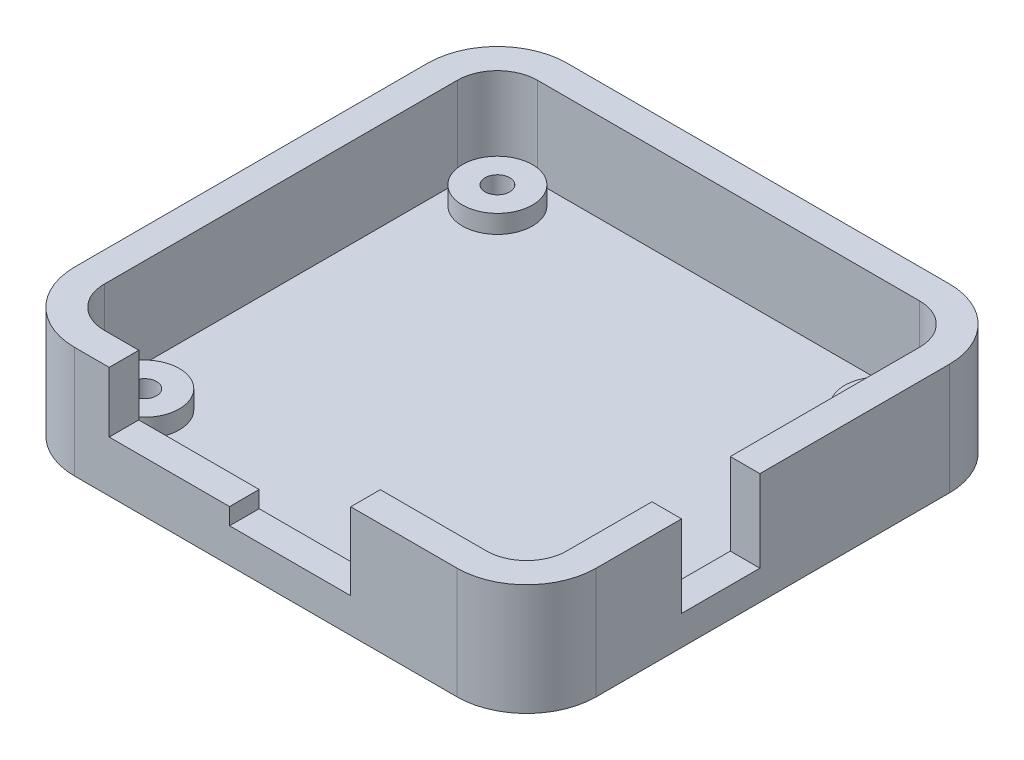
ISO-10303-21;
HEADER;
FILE_DESCRIPTION(('STEP AP214'),'2;1');
FILE_NAME('part.step','',(''),(''),'','','');
FILE_SCHEMA(('AUTOMOTIVE_DESIGN { 1 0 10303 214 1 1 1 1 }'));
ENDSEC;
DATA;
#1=APPLICATION_CONTEXT('core data for automotive mechanical design processes');
#2=APPLICATION_PROTOCOL_DEFINITION('international standard','automotive_design',2000,#1);
#3=PRODUCT_CONTEXT('',#1,'mechanical');
#4=PRODUCT('Part','Part','',(#3));
#5=PRODUCT_RELATED_PRODUCT_CATEGORY('part','',(#4));
#6=PRODUCT_DEFINITION_FORMATION('','',#4);
#7=PRODUCT_DEFINITION_CONTEXT('part definition',#1,'design');
#8=PRODUCT_DEFINITION('design','',#6,#7);
#9=PRODUCT_DEFINITION_SHAPE('','',#8);
#10=(LENGTH_UNIT() NAMED_UNIT(*) SI_UNIT(.MILLI.,.METRE.));
#11=(NAMED_UNIT(*) PLANE_ANGLE_UNIT() SI_UNIT($,.RADIAN.));
#12=(NAMED_UNIT(*) SI_UNIT($,.STERADIAN.) SOLID_ANGLE_UNIT());
#13=UNCERTAINTY_MEASURE_WITH_UNIT(LENGTH_MEASURE(1.E-05),#10,'distance_accuracy_value','');
#14=(GEOMETRIC_REPRESENTATION_CONTEXT(3) GLOBAL_UNCERTAINTY_ASSIGNED_CONTEXT((#13)) GLOBAL_UNIT_ASSIGNED_CONTEXT((#10,
#11,#12)) REPRESENTATION_CONTEXT('',''));
#15=CARTESIAN_POINT('',(0.,0.,0.));
#16=DIRECTION('',(0.,0.,1.));
#17=DIRECTION('',(1.,0.,0.));
#18=AXIS2_PLACEMENT_3D('',#15,#16,#17);
#19=CARTESIAN_POINT('',(42.304,11.3,3.556));
#20=DIRECTION('',(0.,1.,0.));
#21=DIRECTION('',(0.,0.,1.));
#22=AXIS2_PLACEMENT_3D('',#19,#20,#21);
#23=PLANE('',#22);
#24=DIRECTION('',(0.,0.,1.));
#25=VECTOR('',#24,1.);
#26=CARTESIAN_POINT('',(7.056,11.3,-3.501));
#27=LINE('',#26,#25);
#28=CARTESIAN_POINT('',(7.056,11.3,43.4));
#29=VERTEX_POINT('',#28);
#30=CARTESIAN_POINT('',(7.056,11.3,46.4));
#31=VERTEX_POINT('',#30);
#32=EDGE_CURVE('E605',#29,#31,#27,.T.);
#33=ORIENTED_EDGE('',*,*,#32,.F.);
#34=DIRECTION('',(-1.,0.,0.));
#35=VECTOR('',#34,1.);
#36=CARTESIAN_POINT('',(0.,11.3,43.4));
#37=LINE('',#36,#35);
#38=CARTESIAN_POINT('',(3.556,11.3,43.4));
#39=VERTEX_POINT('',#38);
#40=EDGE_CURVE('E318',#29,#39,#37,.T.);
#41=ORIENTED_EDGE('',*,*,#40,.T.);
#42=CARTESIAN_POINT('',(3.556,11.3,39.344));
#43=DIRECTION('',(0.,1.,0.));
#44=DIRECTION('',(0.,0.,1.));
#45=AXIS2_PLACEMENT_3D('',#42,#43,#44);
#46=CIRCLE('',#45,4.056);
#47=CARTESIAN_POINT('',(-0.499999999999998,11.3,39.344));
#48=VERTEX_POINT('',#47);
#49=EDGE_CURVE('E317',#48,#39,#46,.T.);
#50=ORIENTED_EDGE('',*,*,#49,.F.);
#51=DIRECTION('',(0.,0.,-1.));
#52=VECTOR('',#51,1.);
#53=CARTESIAN_POINT('',(-0.5,11.3,0.));
#54=LINE('',#53,#52);
#55=CARTESIAN_POINT('',(-0.5,11.3,3.556));
#56=VERTEX_POINT('',#55);
#57=EDGE_CURVE('E356',#48,#56,#54,.T.);
#58=ORIENTED_EDGE('',*,*,#57,.T.);
#59=CARTESIAN_POINT('',(3.556,11.3,3.556));
#60=DIRECTION('',(0.,1.,0.));
#61=DIRECTION('',(0.,0.,1.));
#62=AXIS2_PLACEMENT_3D('',#59,#60,#61);
#63=CIRCLE('',#62,4.056);
#64=CARTESIAN_POINT('',(3.556,11.3,-0.5));
#65=VERTEX_POINT('',#64);
#66=EDGE_CURVE('E649',#65,#56,#63,.T.);
#67=ORIENTED_EDGE('',*,*,#66,.F.);
#68=DIRECTION('',(-1.,0.,0.));
#69=VECTOR('',#68,1.);
#70=CARTESIAN_POINT('',(0.,11.3,-0.5));
#71=LINE('',#70,#69);
#72=CARTESIAN_POINT('',(42.304,11.3,-0.500000000000002));
#73=VERTEX_POINT('',#72);
#74=EDGE_CURVE('E652',#73,#65,#71,.T.);
#75=ORIENTED_EDGE('',*,*,#74,.F.);
#76=CARTESIAN_POINT('',(42.304,11.3,3.556));
#77=DIRECTION('',(0.,1.,0.));
#78=DIRECTION('',(0.,0.,1.));
#79=AXIS2_PLACEMENT_3D('',#76,#77,#78);
#80=CIRCLE('',#79,4.056);
#81=CARTESIAN_POINT('',(46.36,11.3,3.556));
#82=VERTEX_POINT('',#81);
#83=EDGE_CURVE('E656',#82,#73,#80,.T.);
#84=ORIENTED_EDGE('',*,*,#83,.F.);
#85=DIRECTION('',(0.,0.,-1.));
#86=VECTOR('',#85,1.);
#87=CARTESIAN_POINT('',(46.36,11.3,0.));
#88=LINE('',#87,#86);
#89=CARTESIAN_POINT('',(46.36,11.3,22.756));
#90=VERTEX_POINT('',#89);
#91=EDGE_CURVE('E658',#90,#82,#88,.T.);
#92=ORIENTED_EDGE('',*,*,#91,.F.);
#93=DIRECTION('',(1.,0.,0.));
#94=VECTOR('',#93,1.);
#95=CARTESIAN_POINT('',(-3.501,11.3,22.756));
#96=LINE('',#95,#94);
#97=CARTESIAN_POINT('',(49.36,11.3,22.756));
#98=VERTEX_POINT('',#97);
#99=EDGE_CURVE('E636',#90,#98,#96,.T.);
#100=ORIENTED_EDGE('',*,*,#99,.T.);
#101=DIRECTION('',(0.,0.,-1.));
#102=VECTOR('',#101,1.);
#103=CARTESIAN_POINT('',(49.36,11.3,0.));
#104=LINE('',#103,#102);
#105=CARTESIAN_POINT('',(49.36,11.3,3.556));
#106=VERTEX_POINT('',#105);
#107=EDGE_CURVE('E415',#98,#106,#104,.T.);
#108=ORIENTED_EDGE('',*,*,#107,.T.);
#109=CARTESIAN_POINT('',(42.304,11.3,3.556));
#110=DIRECTION('',(0.,1.,0.));
#111=DIRECTION('',(0.,0.,1.));
#112=AXIS2_PLACEMENT_3D('',#109,#110,#111);
#113=CIRCLE('',#112,7.056);
#114=CARTESIAN_POINT('',(42.304,11.3,-3.5));
#115=VERTEX_POINT('',#114);
#116=EDGE_CURVE('E361',#106,#115,#113,.T.);
#117=ORIENTED_EDGE('',*,*,#116,.T.);
#118=DIRECTION('',(-1.,0.,0.));
#119=VECTOR('',#118,1.);
#120=CARTESIAN_POINT('',(0.,11.3,-3.5));
#121=LINE('',#120,#119);
#122=CARTESIAN_POINT('',(3.556,11.3,-3.5));
#123=VERTEX_POINT('',#122);
#124=EDGE_CURVE('E391',#115,#123,#121,.T.);
#125=ORIENTED_EDGE('',*,*,#124,.T.);
#126=CARTESIAN_POINT('',(3.556,11.3,3.556));
#127=DIRECTION('',(0.,1.,0.));
#128=DIRECTION('',(0.,0.,1.));
#129=AXIS2_PLACEMENT_3D('',#126,#127,#128);
#130=CIRCLE('',#129,7.056);
#131=CARTESIAN_POINT('',(-3.5,11.3,3.556));
#132=VERTEX_POINT('',#131);
#133=EDGE_CURVE('E395',#123,#132,#130,.T.);
#134=ORIENTED_EDGE('',*,*,#133,.T.);
#135=DIRECTION('',(0.,0.,-1.));
#136=VECTOR('',#135,1.);
#137=CARTESIAN_POINT('',(-3.5,11.3,0.));
#138=LINE('',#137,#136);
#139=CARTESIAN_POINT('',(-3.5,11.3,39.344));
#140=VERTEX_POINT('',#139);
#141=EDGE_CURVE('E399',#140,#132,#138,.T.);
#142=ORIENTED_EDGE('',*,*,#141,.F.);
#143=CARTESIAN_POINT('',(3.556,11.3,39.344));
#144=DIRECTION('',(0.,1.,0.));
#145=DIRECTION('',(0.,0.,1.));
#146=AXIS2_PLACEMENT_3D('',#143,#144,#145);
#147=CIRCLE('',#146,7.056);
#148=CARTESIAN_POINT('',(3.556,11.3,46.4));
#149=VERTEX_POINT('',#148);
#150=EDGE_CURVE('E403',#140,#149,#147,.T.);
#151=ORIENTED_EDGE('',*,*,#150,.T.);
#152=DIRECTION('',(-1.,0.,0.));
#153=VECTOR('',#152,1.);
#154=CARTESIAN_POINT('',(0.,11.3,46.4));
#155=LINE('',#154,#153);
#156=EDGE_CURVE('E407',#31,#149,#155,.T.);
#157=ORIENTED_EDGE('',*,*,#156,.F.);
#158=EDGE_LOOP('',(#33,#41,#50,#58,#67,#75,#84,#92,#100,#108,#117,#125,#134,#142,#151,#157));
#159=FACE_BOUND('',#158,.T.);
#160=ADVANCED_FACE('F114',(#159),#23,.T.);
#161=CARTESIAN_POINT('',(0.,2.3,0.));
#162=DIRECTION('',(0.,1.,0.));
#163=DIRECTION('',(0.,0.,1.));
#164=AXIS2_PLACEMENT_3D('',#161,#162,#163);
#165=PLANE('',#164);
#166=CARTESIAN_POINT('',(3.556,2.3,3.556));
#167=DIRECTION('',(0.,1.,0.));
#168=DIRECTION('',(0.,0.,1.));
#169=AXIS2_PLACEMENT_3D('',#166,#167,#168);
#170=CIRCLE('',#169,4.056);
#171=CARTESIAN_POINT('',(3.556,2.3,-0.5));
#172=VERTEX_POINT('',#171);
#173=CARTESIAN_POINT('',(-0.5,2.3,3.556));
#174=VERTEX_POINT('',#173);
#175=EDGE_CURVE('E334',#172,#174,#170,.T.);
#176=ORIENTED_EDGE('',*,*,#175,.T.);
#177=DIRECTION('',(0.,0.,-1.));
#178=VECTOR('',#177,1.);
#179=CARTESIAN_POINT('',(-0.5,2.3,0.));
#180=LINE('',#179,#178);
#181=CARTESIAN_POINT('',(-0.499999999999998,2.3,39.344));
#182=VERTEX_POINT('',#181);
#183=EDGE_CURVE('E330',#182,#174,#180,.T.);
#184=ORIENTED_EDGE('',*,*,#183,.F.);
#185=CARTESIAN_POINT('',(3.556,2.3,39.344));
#186=DIRECTION('',(0.,1.,0.));
#187=DIRECTION('',(0.,0.,1.));
#188=AXIS2_PLACEMENT_3D('',#185,#186,#187);
#189=CIRCLE('',#188,4.056);
#190=CARTESIAN_POINT('',(3.556,2.3,43.4));
#191=VERTEX_POINT('',#190);
#192=EDGE_CURVE('E353',#182,#191,#189,.T.);
#193=ORIENTED_EDGE('',*,*,#192,.T.);
#194=DIRECTION('',(-1.,0.,0.));
#195=VECTOR('',#194,1.);
#196=CARTESIAN_POINT('',(0.,2.3,43.4));
#197=LINE('',#196,#195);
#198=CARTESIAN_POINT('',(42.304,2.3,43.4));
#199=VERTEX_POINT('',#198);
#200=EDGE_CURVE('E349',#199,#191,#197,.T.);
#201=ORIENTED_EDGE('',*,*,#200,.F.);
#202=CARTESIAN_POINT('',(42.304,2.3,39.344));
#203=DIRECTION('',(0.,1.,0.));
#204=DIRECTION('',(0.,0.,1.));
#205=AXIS2_PLACEMENT_3D('',#202,#203,#204);
#206=CIRCLE('',#205,4.056);
#207=CARTESIAN_POINT('',(46.36,2.3,39.344));
#208=VERTEX_POINT('',#207);
#209=EDGE_CURVE('E346',#199,#208,#206,.T.);
#210=ORIENTED_EDGE('',*,*,#209,.T.);
#211=DIRECTION('',(0.,0.,-1.));
#212=VECTOR('',#211,1.);
#213=CARTESIAN_POINT('',(46.36,2.3,0.));
#214=LINE('',#213,#212);
#215=CARTESIAN_POINT('',(46.36,2.3,3.556));
#216=VERTEX_POINT('',#215);
#217=EDGE_CURVE('E343',#208,#216,#214,.T.);
#218=ORIENTED_EDGE('',*,*,#217,.T.);
#219=CARTESIAN_POINT('',(42.304,2.3,3.556));
#220=DIRECTION('',(0.,1.,0.));
#221=DIRECTION('',(0.,0.,1.));
#222=AXIS2_PLACEMENT_3D('',#219,#220,#221);
#223=CIRCLE('',#222,4.056);
#224=CARTESIAN_POINT('',(42.304,2.3,-0.5));
#225=VERTEX_POINT('',#224);
#226=EDGE_CURVE('E340',#216,#225,#223,.T.);
#227=ORIENTED_EDGE('',*,*,#226,.T.);
#228=DIRECTION('',(-1.,0.,0.));
#229=VECTOR('',#228,1.);
#230=CARTESIAN_POINT('',(0.,2.3,-0.5));
#231=LINE('',#230,#229);
#232=EDGE_CURVE('E337',#225,#172,#231,.T.);
#233=ORIENTED_EDGE('',*,*,#232,.T.);
#234=EDGE_LOOP('',(#176,#184,#193,#201,#210,#218,#227,#233));
#235=FACE_BOUND('',#234,.T.);
#236=CARTESIAN_POINT('',(42.304,2.3,39.344));
#237=DIRECTION('',(0.,1.,0.));
#238=DIRECTION('',(0.,0.,1.));
#239=AXIS2_PLACEMENT_3D('',#236,#237,#238);
#240=CIRCLE('',#239,3.55);
#241=CARTESIAN_POINT('',(42.304,2.3,42.894));
#242=VERTEX_POINT('',#241);
#243=EDGE_CURVE('E436',#242,#242,#240,.T.);
#244=ORIENTED_EDGE('',*,*,#243,.F.);
#245=EDGE_LOOP('',(#244));
#246=FACE_BOUND('',#245,.T.);
#247=CARTESIAN_POINT('',(3.556,2.3,3.556));
#248=DIRECTION('',(0.,1.,0.));
#249=DIRECTION('',(0.,0.,1.));
#250=AXIS2_PLACEMENT_3D('',#247,#248,#249);
#251=CIRCLE('',#250,3.55);
#252=CARTESIAN_POINT('',(3.556,2.3,7.106));
#253=VERTEX_POINT('',#252);
#254=EDGE_CURVE('E459',#253,#253,#251,.T.);
#255=ORIENTED_EDGE('',*,*,#254,.F.);
#256=EDGE_LOOP('',(#255));
#257=FACE_BOUND('',#256,.T.);
#258=CARTESIAN_POINT('',(42.304,2.3,3.556));
#259=DIRECTION('',(0.,1.,0.));
#260=DIRECTION('',(0.,0.,1.));
#261=AXIS2_PLACEMENT_3D('',#258,#259,#260);
#262=CIRCLE('',#261,3.55);
#263=CARTESIAN_POINT('',(42.304,2.3,7.106));
#264=VERTEX_POINT('',#263);
#265=EDGE_CURVE('E448',#264,#264,#262,.T.);
#266=ORIENTED_EDGE('',*,*,#265,.F.);
#267=EDGE_LOOP('',(#266));
#268=FACE_BOUND('',#267,.T.);
#269=CARTESIAN_POINT('',(3.556,2.3,39.344));
#270=DIRECTION('',(0.,1.,0.));
#271=DIRECTION('',(0.,0.,1.));
#272=AXIS2_PLACEMENT_3D('',#269,#270,#271);
#273=CIRCLE('',#272,3.55);
#274=CARTESIAN_POINT('',(3.556,2.3,42.894));
#275=VERTEX_POINT('',#274);
#276=EDGE_CURVE('E424',#275,#275,#273,.T.);
#277=ORIENTED_EDGE('',*,*,#276,.F.);
#278=EDGE_LOOP('',(#277));
#279=FACE_BOUND('',#278,.T.);
#280=ADVANCED_FACE('F682',(#235,#246,#257,#268,#279),#165,.T.);
#281=CARTESIAN_POINT('',(3.556,2.3,3.556));
#282=DIRECTION('',(0.,-1.,0.));
#283=DIRECTION('',(0.,0.,-1.));
#284=AXIS2_PLACEMENT_3D('',#281,#282,#283);
#285=CYLINDRICAL_SURFACE('',#284,7.056);
#286=CARTESIAN_POINT('',(3.556,0.,3.556));
#287=DIRECTION('',(0.,1.,0.));
#288=DIRECTION('',(0.,0.,1.));
#289=AXIS2_PLACEMENT_3D('',#286,#287,#288);
#290=CIRCLE('',#289,7.056);
#291=CARTESIAN_POINT('',(-3.5,0.,3.556));
#292=VERTEX_POINT('',#291);
#293=CARTESIAN_POINT('',(3.556,0.,-3.5));
#294=VERTEX_POINT('',#293);
#295=EDGE_CURVE('E464',#292,#294,#290,.F.);
#296=ORIENTED_EDGE('',*,*,#295,.F.);
#297=DIRECTION('',(0.,-1.,0.));
#298=VECTOR('',#297,1.);
#299=CARTESIAN_POINT('',(-3.5,2.3,3.556));
#300=LINE('',#299,#298);
#301=EDGE_CURVE('E12',#132,#292,#300,.T.);
#302=ORIENTED_EDGE('',*,*,#301,.F.);
#303=ORIENTED_EDGE('',*,*,#133,.F.);
#304=DIRECTION('',(0.,-1.,0.));
#305=VECTOR('',#304,1.);
#306=CARTESIAN_POINT('',(3.556,2.3,-3.5));
#307=LINE('',#306,#305);
#308=EDGE_CURVE('E515',#123,#294,#307,.T.);
#309=ORIENTED_EDGE('',*,*,#308,.T.);
#310=EDGE_LOOP('',(#296,#302,#303,#309));
#311=FACE_BOUND('',#310,.T.);
#312=ADVANCED_FACE('F116',(#311),#285,.T.);
#313=CARTESIAN_POINT('',(-3.5,2.3,0.));
#314=DIRECTION('',(1.,0.,0.));
#315=DIRECTION('',(0.,0.,-1.));
#316=AXIS2_PLACEMENT_3D('',#313,#314,#315);
#317=PLANE('',#316);
#318=DIRECTION('',(0.,0.,1.));
#319=VECTOR('',#318,1.);
#320=CARTESIAN_POINT('',(-3.5,0.,0.));
#321=LINE('',#320,#319);
#322=CARTESIAN_POINT('',(-3.5,0.,39.344));
#323=VERTEX_POINT('',#322);
#324=EDGE_CURVE('E471',#292,#323,#321,.T.);
#325=ORIENTED_EDGE('',*,*,#324,.T.);
#326=DIRECTION('',(0.,-1.,0.));
#327=VECTOR('',#326,1.);
#328=CARTESIAN_POINT('',(-3.5,2.3,39.344));
#329=LINE('',#328,#327);
#330=EDGE_CURVE('E123',#140,#323,#329,.T.);
#331=ORIENTED_EDGE('',*,*,#330,.F.);
#332=ORIENTED_EDGE('',*,*,#141,.T.);
#333=ORIENTED_EDGE('',*,*,#301,.T.);
#334=EDGE_LOOP('',(#325,#331,#332,#333));
#335=FACE_BOUND('',#334,.T.);
#336=ADVANCED_FACE('F541',(#335),#317,.F.);
#337=CARTESIAN_POINT('',(3.556,2.3,39.344));
#338=DIRECTION('',(0.,-1.,0.));
#339=DIRECTION('',(0.,0.,-1.));
#340=AXIS2_PLACEMENT_3D('',#337,#338,#339);
#341=CYLINDRICAL_SURFACE('',#340,7.056);
#342=CARTESIAN_POINT('',(3.556,0.,39.344));
#343=DIRECTION('',(0.,1.,0.));
#344=DIRECTION('',(0.,0.,1.));
#345=AXIS2_PLACEMENT_3D('',#342,#343,#344);
#346=CIRCLE('',#345,7.056);
#347=CARTESIAN_POINT('',(3.556,0.,46.4));
#348=VERTEX_POINT('',#347);
#349=EDGE_CURVE('E475',#348,#323,#346,.F.);
#350=ORIENTED_EDGE('',*,*,#349,.F.);
#351=DIRECTION('',(0.,-1.,0.));
#352=VECTOR('',#351,1.);
#353=CARTESIAN_POINT('',(3.556,2.3,46.4));
#354=LINE('',#353,#352);
#355=EDGE_CURVE('E530',#149,#348,#354,.T.);
#356=ORIENTED_EDGE('',*,*,#355,.F.);
#357=ORIENTED_EDGE('',*,*,#150,.F.);
#358=ORIENTED_EDGE('',*,*,#330,.T.);
#359=EDGE_LOOP('',(#350,#356,#357,#358));
#360=FACE_BOUND('',#359,.T.);
#361=ADVANCED_FACE('F536',(#360),#341,.T.);
#362=CARTESIAN_POINT('',(0.,2.3,46.4));
#363=DIRECTION('',(0.,0.,-1.));
#364=DIRECTION('',(-1.,0.,0.));
#365=AXIS2_PLACEMENT_3D('',#362,#363,#364);
#366=PLANE('',#365);
#367=DIRECTION('',(1.,0.,0.));
#368=VECTOR('',#367,1.);
#369=CARTESIAN_POINT('',(31.534,3.49,46.4));
#370=LINE('',#369,#368);
#371=CARTESIAN_POINT('',(19.254,3.49,46.4));
#372=VERTEX_POINT('',#371);
#373=CARTESIAN_POINT('',(31.534,3.49,46.4));
#374=VERTEX_POINT('',#373);
#375=EDGE_CURVE('E300',#372,#374,#370,.T.);
#376=ORIENTED_EDGE('',*,*,#375,.F.);
#377=DIRECTION('',(0.,-1.,0.));
#378=VECTOR('',#377,1.);
#379=CARTESIAN_POINT('',(19.254,11.3,46.4));
#380=LINE('',#379,#378);
#381=CARTESIAN_POINT('',(19.254,5.18,46.4));
#382=VERTEX_POINT('',#381);
#383=EDGE_CURVE('E579',#382,#372,#380,.T.);
#384=ORIENTED_EDGE('',*,*,#383,.F.);
#385=DIRECTION('',(1.,0.,0.));
#386=VECTOR('',#385,1.);
#387=CARTESIAN_POINT('',(7.056,5.18,46.4));
#388=LINE('',#387,#386);
#389=CARTESIAN_POINT('',(7.056,5.18,46.4));
#390=VERTEX_POINT('',#389);
#391=EDGE_CURVE('E600',#390,#382,#388,.T.);
#392=ORIENTED_EDGE('',*,*,#391,.F.);
#393=DIRECTION('',(0.,-1.,0.));
#394=VECTOR('',#393,1.);
#395=CARTESIAN_POINT('',(7.056,11.3,46.4));
#396=LINE('',#395,#394);
#397=EDGE_CURVE('E596',#31,#390,#396,.T.);
#398=ORIENTED_EDGE('',*,*,#397,.F.);
#399=ORIENTED_EDGE('',*,*,#156,.T.);
#400=ORIENTED_EDGE('',*,*,#355,.T.);
#401=DIRECTION('',(1.,0.,0.));
#402=VECTOR('',#401,1.);
#403=CARTESIAN_POINT('',(0.,0.,46.4));
#404=LINE('',#403,#402);
#405=CARTESIAN_POINT('',(42.304,0.,46.4));
#406=VERTEX_POINT('',#405);
#407=EDGE_CURVE('E479',#348,#406,#404,.T.);
#408=ORIENTED_EDGE('',*,*,#407,.T.);
#409=DIRECTION('',(0.,-1.,0.));
#410=VECTOR('',#409,1.);
#411=CARTESIAN_POINT('',(42.304,2.3,46.4));
#412=LINE('',#411,#410);
#413=CARTESIAN_POINT('',(42.304,11.3,46.4));
#414=VERTEX_POINT('',#413);
#415=EDGE_CURVE('E527',#414,#406,#412,.T.);
#416=ORIENTED_EDGE('',*,*,#415,.F.);
#417=CARTESIAN_POINT('',(31.534,11.3,46.4));
#418=VERTEX_POINT('',#417);
#419=EDGE_CURVE('E408',#414,#418,#155,.T.);
#420=ORIENTED_EDGE('',*,*,#419,.T.);
#421=DIRECTION('',(0.,1.,0.));
#422=VECTOR('',#421,1.);
#423=CARTESIAN_POINT('',(31.534,11.3,46.4));
#424=LINE('',#423,#422);
#425=EDGE_CURVE('E293',#374,#418,#424,.T.);
#426=ORIENTED_EDGE('',*,*,#425,.F.);
#427=EDGE_LOOP('',(#376,#384,#392,#398,#399,#400,#408,#416,#420,#426));
#428=FACE_BOUND('',#427,.T.);
#429=ADVANCED_FACE('F550',(#428),#366,.F.);
#430=CARTESIAN_POINT('',(42.304,2.3,39.344));
#431=DIRECTION('',(0.,-1.,0.));
#432=DIRECTION('',(0.,0.,-1.));
#433=AXIS2_PLACEMENT_3D('',#430,#431,#432);
#434=CYLINDRICAL_SURFACE('',#433,7.056);
#435=CARTESIAN_POINT('',(42.304,0.,39.344));
#436=DIRECTION('',(0.,1.,0.));
#437=DIRECTION('',(0.,0.,1.));
#438=AXIS2_PLACEMENT_3D('',#435,#436,#437);
#439=CIRCLE('',#438,7.056);
#440=CARTESIAN_POINT('',(49.36,0.,39.344));
#441=VERTEX_POINT('',#440);
#442=EDGE_CURVE('E483',#441,#406,#439,.F.);
#443=ORIENTED_EDGE('',*,*,#442,.F.);
#444=DIRECTION('',(0.,-1.,0.));
#445=VECTOR('',#444,1.);
#446=CARTESIAN_POINT('',(49.36,2.3,39.344));
#447=LINE('',#446,#445);
#448=CARTESIAN_POINT('',(49.36,11.3,39.344));
#449=VERTEX_POINT('',#448);
#450=EDGE_CURVE('E524',#449,#441,#447,.T.);
#451=ORIENTED_EDGE('',*,*,#450,.F.);
#452=CARTESIAN_POINT('',(42.304,11.3,39.344));
#453=DIRECTION('',(0.,1.,0.));
#454=DIRECTION('',(0.,0.,1.));
#455=AXIS2_PLACEMENT_3D('',#452,#453,#454);
#456=CIRCLE('',#455,7.056);
#457=EDGE_CURVE('E411',#414,#449,#456,.T.);
#458=ORIENTED_EDGE('',*,*,#457,.F.);
#459=ORIENTED_EDGE('',*,*,#415,.T.);
#460=EDGE_LOOP('',(#443,#451,#458,#459));
#461=FACE_BOUND('',#460,.T.);
#462=ADVANCED_FACE('F575',(#461),#434,.T.);
#463=CARTESIAN_POINT('',(49.36,2.3,0.));
#464=DIRECTION('',(1.,0.,0.));
#465=DIRECTION('',(0.,0.,-1.));
#466=AXIS2_PLACEMENT_3D('',#463,#464,#465);
#467=PLANE('',#466);
#468=DIRECTION('',(0.,1.,0.));
#469=VECTOR('',#468,1.);
#470=CARTESIAN_POINT('',(49.36,11.3,22.756));
#471=LINE('',#470,#469);
#472=CARTESIAN_POINT('',(49.36,3.,22.756));
#473=VERTEX_POINT('',#472);
#474=EDGE_CURVE('E619',#473,#98,#471,.T.);
#475=ORIENTED_EDGE('',*,*,#474,.F.);
#476=DIRECTION('',(0.,0.,-1.));
#477=VECTOR('',#476,1.);
#478=CARTESIAN_POINT('',(49.36,3.,30.694));
#479=LINE('',#478,#477);
#480=CARTESIAN_POINT('',(49.36,3.,30.694));
#481=VERTEX_POINT('',#480);
#482=EDGE_CURVE('E622',#481,#473,#479,.T.);
#483=ORIENTED_EDGE('',*,*,#482,.F.);
#484=DIRECTION('',(0.,-1.,0.));
#485=VECTOR('',#484,1.);
#486=CARTESIAN_POINT('',(49.36,11.3,30.694));
#487=LINE('',#486,#485);
#488=CARTESIAN_POINT('',(49.36,11.3,30.694));
#489=VERTEX_POINT('',#488);
#490=EDGE_CURVE('E613',#489,#481,#487,.T.);
#491=ORIENTED_EDGE('',*,*,#490,.F.);
#492=EDGE_CURVE('E416',#449,#489,#104,.T.);
#493=ORIENTED_EDGE('',*,*,#492,.F.);
#494=ORIENTED_EDGE('',*,*,#450,.T.);
#495=DIRECTION('',(0.,0.,1.));
#496=VECTOR('',#495,1.);
#497=CARTESIAN_POINT('',(49.36,0.,0.));
#498=LINE('',#497,#496);
#499=CARTESIAN_POINT('',(49.36,0.,3.556));
#500=VERTEX_POINT('',#499);
#501=EDGE_CURVE('E487',#500,#441,#498,.T.);
#502=ORIENTED_EDGE('',*,*,#501,.F.);
#503=DIRECTION('',(0.,-1.,0.));
#504=VECTOR('',#503,1.);
#505=CARTESIAN_POINT('',(49.36,2.3,3.556));
#506=LINE('',#505,#504);
#507=EDGE_CURVE('E521',#106,#500,#506,.T.);
#508=ORIENTED_EDGE('',*,*,#507,.F.);
#509=ORIENTED_EDGE('',*,*,#107,.F.);
#510=EDGE_LOOP('',(#475,#483,#491,#493,#494,#502,#508,#509));
#511=FACE_BOUND('',#510,.T.);
#512=ADVANCED_FACE('F570',(#511),#467,.T.);
#513=CARTESIAN_POINT('',(42.304,2.3,3.556));
#514=DIRECTION('',(0.,-1.,0.));
#515=DIRECTION('',(0.,0.,-1.));
#516=AXIS2_PLACEMENT_3D('',#513,#514,#515);
#517=CYLINDRICAL_SURFACE('',#516,7.056);
#518=CARTESIAN_POINT('',(42.304,0.,3.556));
#519=DIRECTION('',(0.,1.,0.));
#520=DIRECTION('',(0.,0.,1.));
#521=AXIS2_PLACEMENT_3D('',#518,#519,#520);
#522=CIRCLE('',#521,7.056);
#523=CARTESIAN_POINT('',(42.304,0.,-3.5));
#524=VERTEX_POINT('',#523);
#525=EDGE_CURVE('E491',#524,#500,#522,.F.);
#526=ORIENTED_EDGE('',*,*,#525,.F.);
#527=DIRECTION('',(0.,-1.,0.));
#528=VECTOR('',#527,1.);
#529=CARTESIAN_POINT('',(42.304,2.3,-3.5));
#530=LINE('',#529,#528);
#531=EDGE_CURVE('E518',#115,#524,#530,.T.);
#532=ORIENTED_EDGE('',*,*,#531,.F.);
#533=ORIENTED_EDGE('',*,*,#116,.F.);
#534=ORIENTED_EDGE('',*,*,#507,.T.);
#535=EDGE_LOOP('',(#526,#532,#533,#534));
#536=FACE_BOUND('',#535,.T.);
#537=ADVANCED_FACE('F565',(#536),#517,.T.);
#538=CARTESIAN_POINT('',(42.304,2.3,39.344));
#539=DIRECTION('',(0.,-1.,0.));
#540=DIRECTION('',(0.,0.,-1.));
#541=AXIS2_PLACEMENT_3D('',#538,#539,#540);
#542=CYLINDRICAL_SURFACE('',#541,1.25);
#543=CARTESIAN_POINT('',(42.304,0.,39.344));
#544=DIRECTION('',(0.,1.,0.));
#545=DIRECTION('',(0.,0.,1.));
#546=AXIS2_PLACEMENT_3D('',#543,#544,#545);
#547=CIRCLE('',#546,1.25);
#548=CARTESIAN_POINT('',(42.304,0.,40.594));
#549=VERTEX_POINT('',#548);
#550=EDGE_CURVE('E507',#549,#549,#547,.T.);
#551=ORIENTED_EDGE('',*,*,#550,.F.);
#552=EDGE_LOOP('',(#551));
#553=FACE_BOUND('',#552,.T.);
#554=CARTESIAN_POINT('',(42.304,4.15,39.344));
#555=DIRECTION('',(0.,1.,0.));
#556=DIRECTION('',(0.,0.,1.));
#557=AXIS2_PLACEMENT_3D('',#554,#555,#556);
#558=CIRCLE('',#557,1.25);
#559=CARTESIAN_POINT('',(42.304,4.15,40.594));
#560=VERTEX_POINT('',#559);
#561=EDGE_CURVE('E429',#560,#560,#558,.T.);
#562=ORIENTED_EDGE('',*,*,#561,.T.);
#563=EDGE_LOOP('',(#562));
#564=FACE_BOUND('',#563,.T.);
#565=ADVANCED_FACE('F785',(#553,#564),#542,.F.);
#566=CARTESIAN_POINT('',(42.304,2.3,3.556));
#567=DIRECTION('',(0.,-1.,0.));
#568=DIRECTION('',(0.,0.,-1.));
#569=AXIS2_PLACEMENT_3D('',#566,#567,#568);
#570=CYLINDRICAL_SURFACE('',#569,1.25);
#571=CARTESIAN_POINT('',(42.304,0.,3.556));
#572=DIRECTION('',(0.,1.,0.));
#573=DIRECTION('',(0.,0.,1.));
#574=AXIS2_PLACEMENT_3D('',#571,#572,#573);
#575=CIRCLE('',#574,1.25);
#576=CARTESIAN_POINT('',(42.304,0.,4.806));
#577=VERTEX_POINT('',#576);
#578=EDGE_CURVE('E503',#577,#577,#575,.T.);
#579=ORIENTED_EDGE('',*,*,#578,.F.);
#580=EDGE_LOOP('',(#579));
#581=FACE_BOUND('',#580,.T.);
#582=CARTESIAN_POINT('',(42.304,4.15,3.556));
#583=DIRECTION('',(0.,1.,0.));
#584=DIRECTION('',(0.,0.,1.));
#585=AXIS2_PLACEMENT_3D('',#582,#583,#584);
#586=CIRCLE('',#585,1.25);
#587=CARTESIAN_POINT('',(42.304,4.15,4.806));
#588=VERTEX_POINT('',#587);
#589=EDGE_CURVE('E441',#588,#588,#586,.T.);
#590=ORIENTED_EDGE('',*,*,#589,.T.);
#591=EDGE_LOOP('',(#590));
#592=FACE_BOUND('',#591,.T.);
#593=ADVANCED_FACE('F788',(#581,#592),#570,.F.);
#594=CARTESIAN_POINT('',(3.556,2.3,3.556));
#595=DIRECTION('',(0.,-1.,0.));
#596=DIRECTION('',(0.,0.,-1.));
#597=AXIS2_PLACEMENT_3D('',#594,#595,#596);
#598=CYLINDRICAL_SURFACE('',#597,1.25);
#599=CARTESIAN_POINT('',(3.556,0.,3.556));
#600=DIRECTION('',(0.,1.,0.));
#601=DIRECTION('',(0.,0.,1.));
#602=AXIS2_PLACEMENT_3D('',#599,#600,#601);
#603=CIRCLE('',#602,1.25);
#604=CARTESIAN_POINT('',(3.556,0.,4.806));
#605=VERTEX_POINT('',#604);
#606=EDGE_CURVE('E499',#605,#605,#603,.T.);
#607=ORIENTED_EDGE('',*,*,#606,.F.);
#608=EDGE_LOOP('',(#607));
#609=FACE_BOUND('',#608,.T.);
#610=CARTESIAN_POINT('',(3.556,4.15,3.556));
#611=DIRECTION('',(0.,1.,0.));
#612=DIRECTION('',(0.,0.,1.));
#613=AXIS2_PLACEMENT_3D('',#610,#611,#612);
#614=CIRCLE('',#613,1.25);
#615=CARTESIAN_POINT('',(3.556,4.15,4.806));
#616=VERTEX_POINT('',#615);
#617=EDGE_CURVE('E453',#616,#616,#614,.T.);
#618=ORIENTED_EDGE('',*,*,#617,.T.);
#619=EDGE_LOOP('',(#618));
#620=FACE_BOUND('',#619,.T.);
#621=ADVANCED_FACE('F792',(#609,#620),#598,.F.);
#622=CARTESIAN_POINT('',(0.,2.3,-3.5));
#623=DIRECTION('',(0.,0.,-1.));
#624=DIRECTION('',(-1.,0.,0.));
#625=AXIS2_PLACEMENT_3D('',#622,#623,#624);
#626=PLANE('',#625);
#627=DIRECTION('',(1.,0.,0.));
#628=VECTOR('',#627,1.);
#629=CARTESIAN_POINT('',(0.,0.,-3.5));
#630=LINE('',#629,#628);
#631=EDGE_CURVE('E495',#294,#524,#630,.T.);
#632=ORIENTED_EDGE('',*,*,#631,.F.);
#633=ORIENTED_EDGE('',*,*,#308,.F.);
#634=ORIENTED_EDGE('',*,*,#124,.F.);
#635=ORIENTED_EDGE('',*,*,#531,.T.);
#636=EDGE_LOOP('',(#632,#633,#634,#635));
#637=FACE_BOUND('',#636,.T.);
#638=ADVANCED_FACE('F561',(#637),#626,.T.);
#639=CARTESIAN_POINT('',(3.556,2.3,39.344));
#640=DIRECTION('',(0.,-1.,0.));
#641=DIRECTION('',(0.,0.,-1.));
#642=AXIS2_PLACEMENT_3D('',#639,#640,#641);
#643=CYLINDRICAL_SURFACE('',#642,1.25);
#644=CARTESIAN_POINT('',(3.556,0.,39.344));
#645=DIRECTION('',(0.,1.,0.));
#646=DIRECTION('',(0.,0.,1.));
#647=AXIS2_PLACEMENT_3D('',#644,#645,#646);
#648=CIRCLE('',#647,1.25);
#649=CARTESIAN_POINT('',(3.556,0.,40.594));
#650=VERTEX_POINT('',#649);
#651=EDGE_CURVE('E511',#650,#650,#648,.T.);
#652=ORIENTED_EDGE('',*,*,#651,.F.);
#653=EDGE_LOOP('',(#652));
#654=FACE_BOUND('',#653,.T.);
#655=CARTESIAN_POINT('',(3.556,4.15,39.344));
#656=DIRECTION('',(0.,1.,0.));
#657=DIRECTION('',(0.,0.,1.));
#658=AXIS2_PLACEMENT_3D('',#655,#656,#657);
#659=CIRCLE('',#658,1.25);
#660=CARTESIAN_POINT('',(3.556,4.15,40.594));
#661=VERTEX_POINT('',#660);
#662=EDGE_CURVE('E420',#661,#661,#659,.T.);
#663=ORIENTED_EDGE('',*,*,#662,.T.);
#664=EDGE_LOOP('',(#663));
#665=FACE_BOUND('',#664,.T.);
#666=ADVANCED_FACE('F781',(#654,#665),#643,.F.);
#667=CARTESIAN_POINT('',(0.,0.,0.));
#668=DIRECTION('',(0.,1.,0.));
#669=DIRECTION('',(0.,0.,1.));
#670=AXIS2_PLACEMENT_3D('',#667,#668,#669);
#671=PLANE('',#670);
#672=ORIENTED_EDGE('',*,*,#295,.T.);
#673=ORIENTED_EDGE('',*,*,#631,.T.);
#674=ORIENTED_EDGE('',*,*,#525,.T.);
#675=ORIENTED_EDGE('',*,*,#501,.T.);
#676=ORIENTED_EDGE('',*,*,#442,.T.);
#677=ORIENTED_EDGE('',*,*,#407,.F.);
#678=ORIENTED_EDGE('',*,*,#349,.T.);
#679=ORIENTED_EDGE('',*,*,#324,.F.);
#680=EDGE_LOOP('',(#672,#673,#674,#675,#676,#677,#678,#679));
#681=FACE_BOUND('',#680,.T.);
#682=ORIENTED_EDGE('',*,*,#606,.T.);
#683=EDGE_LOOP('',(#682));
#684=FACE_BOUND('',#683,.T.);
#685=ORIENTED_EDGE('',*,*,#578,.T.);
#686=EDGE_LOOP('',(#685));
#687=FACE_BOUND('',#686,.T.);
#688=ORIENTED_EDGE('',*,*,#550,.T.);
#689=EDGE_LOOP('',(#688));
#690=FACE_BOUND('',#689,.T.);
#691=ORIENTED_EDGE('',*,*,#651,.T.);
#692=EDGE_LOOP('',(#691));
#693=FACE_BOUND('',#692,.T.);
#694=ADVANCED_FACE('F545',(#681,#684,#687,#690,#693),#671,.F.);
#695=CARTESIAN_POINT('',(3.556,4.15,3.556));
#696=DIRECTION('',(0.,1.,0.));
#697=DIRECTION('',(0.,0.,1.));
#698=AXIS2_PLACEMENT_3D('',#695,#696,#697);
#699=PLANE('',#698);
#700=CARTESIAN_POINT('',(3.556,4.15,3.556));
#701=DIRECTION('',(0.,1.,0.));
#702=DIRECTION('',(0.,0.,1.));
#703=AXIS2_PLACEMENT_3D('',#700,#701,#702);
#704=CIRCLE('',#703,3.55);
#705=CARTESIAN_POINT('',(3.556,4.15,7.106));
#706=VERTEX_POINT('',#705);
#707=EDGE_CURVE('E460',#706,#706,#704,.T.);
#708=ORIENTED_EDGE('',*,*,#707,.T.);
#709=EDGE_LOOP('',(#708));
#710=FACE_BOUND('',#709,.T.);
#711=ORIENTED_EDGE('',*,*,#617,.F.);
#712=EDGE_LOOP('',(#711));
#713=FACE_BOUND('',#712,.T.);
#714=ADVANCED_FACE('F772',(#710,#713),#699,.T.);
#715=CARTESIAN_POINT('',(3.556,4.15,3.556));
#716=DIRECTION('',(0.,-1.,0.));
#717=DIRECTION('',(0.,0.,-1.));
#718=AXIS2_PLACEMENT_3D('',#715,#716,#717);
#719=CYLINDRICAL_SURFACE('',#718,3.55);
#720=ORIENTED_EDGE('',*,*,#707,.F.);
#721=EDGE_LOOP('',(#720));
#722=FACE_BOUND('',#721,.T.);
#723=ORIENTED_EDGE('',*,*,#254,.T.);
#724=EDGE_LOOP('',(#723));
#725=FACE_BOUND('',#724,.T.);
#726=ADVANCED_FACE('F767',(#722,#725),#719,.T.);
#727=CARTESIAN_POINT('',(42.304,4.15,3.556));
#728=DIRECTION('',(0.,1.,0.));
#729=DIRECTION('',(0.,0.,1.));
#730=AXIS2_PLACEMENT_3D('',#727,#728,#729);
#731=PLANE('',#730);
#732=CARTESIAN_POINT('',(42.304,4.15,3.556));
#733=DIRECTION('',(0.,1.,0.));
#734=DIRECTION('',(0.,0.,1.));
#735=AXIS2_PLACEMENT_3D('',#732,#733,#734);
#736=CIRCLE('',#735,3.55);
#737=CARTESIAN_POINT('',(42.304,4.15,7.106));
#738=VERTEX_POINT('',#737);
#739=EDGE_CURVE('E449',#738,#738,#736,.T.);
#740=ORIENTED_EDGE('',*,*,#739,.T.);
#741=EDGE_LOOP('',(#740));
#742=FACE_BOUND('',#741,.T.);
#743=ORIENTED_EDGE('',*,*,#589,.F.);
#744=EDGE_LOOP('',(#743));
#745=FACE_BOUND('',#744,.T.);
#746=ADVANCED_FACE('F764',(#742,#745),#731,.T.);
#747=CARTESIAN_POINT('',(42.304,4.15,3.556));
#748=DIRECTION('',(0.,-1.,0.));
#749=DIRECTION('',(0.,0.,-1.));
#750=AXIS2_PLACEMENT_3D('',#747,#748,#749);
#751=CYLINDRICAL_SURFACE('',#750,3.55);
#752=ORIENTED_EDGE('',*,*,#739,.F.);
#753=EDGE_LOOP('',(#752));
#754=FACE_BOUND('',#753,.T.);
#755=ORIENTED_EDGE('',*,*,#265,.T.);
#756=EDGE_LOOP('',(#755));
#757=FACE_BOUND('',#756,.T.);
#758=ADVANCED_FACE('F759',(#754,#757),#751,.T.);
#759=CARTESIAN_POINT('',(42.304,4.15,39.344));
#760=DIRECTION('',(0.,1.,0.));
#761=DIRECTION('',(0.,0.,1.));
#762=AXIS2_PLACEMENT_3D('',#759,#760,#761);
#763=PLANE('',#762);
#764=CARTESIAN_POINT('',(42.304,4.15,39.344));
#765=DIRECTION('',(0.,1.,0.));
#766=DIRECTION('',(0.,0.,1.));
#767=AXIS2_PLACEMENT_3D('',#764,#765,#766);
#768=CIRCLE('',#767,3.55);
#769=CARTESIAN_POINT('',(42.304,4.15,42.894));
#770=VERTEX_POINT('',#769);
#771=EDGE_CURVE('E437',#770,#770,#768,.T.);
#772=ORIENTED_EDGE('',*,*,#771,.T.);
#773=EDGE_LOOP('',(#772));
#774=FACE_BOUND('',#773,.T.);
#775=ORIENTED_EDGE('',*,*,#561,.F.);
#776=EDGE_LOOP('',(#775));
#777=FACE_BOUND('',#776,.T.);
#778=ADVANCED_FACE('F756',(#774,#777),#763,.T.);
#779=CARTESIAN_POINT('',(42.304,4.15,39.344));
#780=DIRECTION('',(0.,-1.,0.));
#781=DIRECTION('',(0.,0.,-1.));
#782=AXIS2_PLACEMENT_3D('',#779,#780,#781);
#783=CYLINDRICAL_SURFACE('',#782,3.55);
#784=ORIENTED_EDGE('',*,*,#771,.F.);
#785=EDGE_LOOP('',(#784));
#786=FACE_BOUND('',#785,.T.);
#787=ORIENTED_EDGE('',*,*,#243,.T.);
#788=EDGE_LOOP('',(#787));
#789=FACE_BOUND('',#788,.T.);
#790=ADVANCED_FACE('F751',(#786,#789),#783,.T.);
#791=CARTESIAN_POINT('',(3.556,4.15,39.344));
#792=DIRECTION('',(0.,1.,0.));
#793=DIRECTION('',(0.,0.,1.));
#794=AXIS2_PLACEMENT_3D('',#791,#792,#793);
#795=PLANE('',#794);
#796=CARTESIAN_POINT('',(3.556,4.15,39.344));
#797=DIRECTION('',(0.,1.,0.));
#798=DIRECTION('',(0.,0.,1.));
#799=AXIS2_PLACEMENT_3D('',#796,#797,#798);
#800=CIRCLE('',#799,3.55);
#801=CARTESIAN_POINT('',(3.556,4.15,42.894));
#802=VERTEX_POINT('',#801);
#803=EDGE_CURVE('E425',#802,#802,#800,.T.);
#804=ORIENTED_EDGE('',*,*,#803,.T.);
#805=EDGE_LOOP('',(#804));
#806=FACE_BOUND('',#805,.T.);
#807=ORIENTED_EDGE('',*,*,#662,.F.);
#808=EDGE_LOOP('',(#807));
#809=FACE_BOUND('',#808,.T.);
#810=ADVANCED_FACE('F745',(#806,#809),#795,.T.);
#811=CARTESIAN_POINT('',(3.556,4.15,39.344));
#812=DIRECTION('',(0.,-1.,0.));
#813=DIRECTION('',(0.,0.,-1.));
#814=AXIS2_PLACEMENT_3D('',#811,#812,#813);
#815=CYLINDRICAL_SURFACE('',#814,3.55);
#816=ORIENTED_EDGE('',*,*,#803,.F.);
#817=EDGE_LOOP('',(#816));
#818=FACE_BOUND('',#817,.T.);
#819=ORIENTED_EDGE('',*,*,#276,.T.);
#820=EDGE_LOOP('',(#819));
#821=FACE_BOUND('',#820,.T.);
#822=ADVANCED_FACE('F740',(#818,#821),#815,.T.);
#823=DIRECTION('',(0.,0.,1.));
#824=VECTOR('',#823,1.);
#825=CARTESIAN_POINT('',(31.534,11.3,-3.501));
#826=LINE('',#825,#824);
#827=CARTESIAN_POINT('',(31.534,11.3,43.4));
#828=VERTEX_POINT('',#827);
#829=EDGE_CURVE('E287',#828,#418,#826,.T.);
#830=ORIENTED_EDGE('',*,*,#829,.T.);
#831=ORIENTED_EDGE('',*,*,#419,.F.);
#832=ORIENTED_EDGE('',*,*,#457,.T.);
#833=ORIENTED_EDGE('',*,*,#492,.T.);
#834=DIRECTION('',(1.,0.,0.));
#835=VECTOR('',#834,1.);
#836=CARTESIAN_POINT('',(-3.501,11.3,30.694));
#837=LINE('',#836,#835);
#838=CARTESIAN_POINT('',(46.36,11.3,30.694));
#839=VERTEX_POINT('',#838);
#840=EDGE_CURVE('E631',#839,#489,#837,.T.);
#841=ORIENTED_EDGE('',*,*,#840,.F.);
#842=CARTESIAN_POINT('',(46.36,11.3,39.344));
#843=VERTEX_POINT('',#842);
#844=EDGE_CURVE('E659',#843,#839,#88,.T.);
#845=ORIENTED_EDGE('',*,*,#844,.F.);
#846=CARTESIAN_POINT('',(42.304,11.3,39.344));
#847=DIRECTION('',(0.,1.,0.));
#848=DIRECTION('',(0.,0.,1.));
#849=AXIS2_PLACEMENT_3D('',#846,#847,#848);
#850=CIRCLE('',#849,4.056);
#851=CARTESIAN_POINT('',(42.304,11.3,43.4));
#852=VERTEX_POINT('',#851);
#853=EDGE_CURVE('E315',#852,#843,#850,.T.);
#854=ORIENTED_EDGE('',*,*,#853,.F.);
#855=EDGE_CURVE('E308',#852,#828,#37,.T.);
#856=ORIENTED_EDGE('',*,*,#855,.T.);
#857=EDGE_LOOP('',(#830,#831,#832,#833,#841,#845,#854,#856));
#858=FACE_BOUND('',#857,.T.);
#859=ADVANCED_FACE('F313',(#858),#23,.T.);
#860=CARTESIAN_POINT('',(-0.5,11.3,0.));
#861=DIRECTION('',(-1.,0.,0.));
#862=DIRECTION('',(0.,0.,1.));
#863=AXIS2_PLACEMENT_3D('',#860,#861,#862);
#864=PLANE('',#863);
#865=ORIENTED_EDGE('',*,*,#183,.T.);
#866=DIRECTION('',(0.,-1.,0.));
#867=VECTOR('',#866,1.);
#868=CARTESIAN_POINT('',(-0.5,11.3,3.556));
#869=LINE('',#868,#867);
#870=EDGE_CURVE('E324',#56,#174,#869,.T.);
#871=ORIENTED_EDGE('',*,*,#870,.F.);
#872=ORIENTED_EDGE('',*,*,#57,.F.);
#873=DIRECTION('',(0.,-1.,0.));
#874=VECTOR('',#873,1.);
#875=CARTESIAN_POINT('',(-0.499999999999998,11.3,39.344));
#876=LINE('',#875,#874);
#877=EDGE_CURVE('E357',#48,#182,#876,.T.);
#878=ORIENTED_EDGE('',*,*,#877,.T.);
#879=EDGE_LOOP('',(#865,#871,#872,#878));
#880=FACE_BOUND('',#879,.T.);
#881=ADVANCED_FACE('F720',(#880),#864,.F.);
#882=CARTESIAN_POINT('',(3.556,11.3,39.344));
#883=DIRECTION('',(0.,-1.,0.));
#884=DIRECTION('',(0.,0.,-1.));
#885=AXIS2_PLACEMENT_3D('',#882,#883,#884);
#886=CYLINDRICAL_SURFACE('',#885,4.056);
#887=ORIENTED_EDGE('',*,*,#192,.F.);
#888=ORIENTED_EDGE('',*,*,#877,.F.);
#889=ORIENTED_EDGE('',*,*,#49,.T.);
#890=DIRECTION('',(0.,-1.,0.));
#891=VECTOR('',#890,1.);
#892=CARTESIAN_POINT('',(3.556,11.3,43.4));
#893=LINE('',#892,#891);
#894=EDGE_CURVE('E362',#39,#191,#893,.T.);
#895=ORIENTED_EDGE('',*,*,#894,.T.);
#896=EDGE_LOOP('',(#887,#888,#889,#895));
#897=FACE_BOUND('',#896,.T.);
#898=ADVANCED_FACE('F716',(#897),#886,.F.);
#899=CARTESIAN_POINT('',(0.,11.3,43.4));
#900=DIRECTION('',(0.,0.,1.));
#901=DIRECTION('',(1.,0.,0.));
#902=AXIS2_PLACEMENT_3D('',#899,#900,#901);
#903=PLANE('',#902);
#904=DIRECTION('',(-1.,0.,0.));
#905=VECTOR('',#904,1.);
#906=CARTESIAN_POINT('',(7.056,5.18,43.4));
#907=LINE('',#906,#905);
#908=CARTESIAN_POINT('',(19.254,5.18,43.4));
#909=VERTEX_POINT('',#908);
#910=CARTESIAN_POINT('',(7.056,5.18,43.4));
#911=VERTEX_POINT('',#910);
#912=EDGE_CURVE('E608',#909,#911,#907,.T.);
#913=ORIENTED_EDGE('',*,*,#912,.F.);
#914=DIRECTION('',(0.,1.,0.));
#915=VECTOR('',#914,1.);
#916=CARTESIAN_POINT('',(19.254,11.3,43.4));
#917=LINE('',#916,#915);
#918=CARTESIAN_POINT('',(19.254,3.49,43.4));
#919=VERTEX_POINT('',#918);
#920=EDGE_CURVE('E130',#919,#909,#917,.T.);
#921=ORIENTED_EDGE('',*,*,#920,.F.);
#922=DIRECTION('',(-1.,0.,0.));
#923=VECTOR('',#922,1.);
#924=CARTESIAN_POINT('',(31.534,3.49,43.4));
#925=LINE('',#924,#923);
#926=CARTESIAN_POINT('',(31.534,3.49,43.4));
#927=VERTEX_POINT('',#926);
#928=EDGE_CURVE('E310',#927,#919,#925,.T.);
#929=ORIENTED_EDGE('',*,*,#928,.F.);
#930=DIRECTION('',(0.,-1.,0.));
#931=VECTOR('',#930,1.);
#932=CARTESIAN_POINT('',(31.534,11.3,43.4));
#933=LINE('',#932,#931);
#934=EDGE_CURVE('E290',#828,#927,#933,.T.);
#935=ORIENTED_EDGE('',*,*,#934,.F.);
#936=ORIENTED_EDGE('',*,*,#855,.F.);
#937=DIRECTION('',(0.,-1.,0.));
#938=VECTOR('',#937,1.);
#939=CARTESIAN_POINT('',(42.304,11.3,43.4));
#940=LINE('',#939,#938);
#941=EDGE_CURVE('E366',#852,#199,#940,.T.);
#942=ORIENTED_EDGE('',*,*,#941,.T.);
#943=ORIENTED_EDGE('',*,*,#200,.T.);
#944=ORIENTED_EDGE('',*,*,#894,.F.);
#945=ORIENTED_EDGE('',*,*,#40,.F.);
#946=DIRECTION('',(0.,1.,0.));
#947=VECTOR('',#946,1.);
#948=CARTESIAN_POINT('',(7.056,11.3,43.4));
#949=LINE('',#948,#947);
#950=EDGE_CURVE('E591',#911,#29,#949,.T.);
#951=ORIENTED_EDGE('',*,*,#950,.F.);
#952=EDGE_LOOP('',(#913,#921,#929,#935,#936,#942,#943,#944,#945,#951));
#953=FACE_BOUND('',#952,.T.);
#954=ADVANCED_FACE('F306',(#953),#903,.F.);
#955=CARTESIAN_POINT('',(42.304,11.3,39.344));
#956=DIRECTION('',(0.,-1.,0.));
#957=DIRECTION('',(0.,0.,-1.));
#958=AXIS2_PLACEMENT_3D('',#955,#956,#957);
#959=CYLINDRICAL_SURFACE('',#958,4.056);
#960=ORIENTED_EDGE('',*,*,#209,.F.);
#961=ORIENTED_EDGE('',*,*,#941,.F.);
#962=ORIENTED_EDGE('',*,*,#853,.T.);
#963=DIRECTION('',(0.,-1.,0.));
#964=VECTOR('',#963,1.);
#965=CARTESIAN_POINT('',(46.36,11.3,39.344));
#966=LINE('',#965,#964);
#967=EDGE_CURVE('E369',#843,#208,#966,.T.);
#968=ORIENTED_EDGE('',*,*,#967,.T.);
#969=EDGE_LOOP('',(#960,#961,#962,#968));
#970=FACE_BOUND('',#969,.T.);
#971=ADVANCED_FACE('F866',(#970),#959,.F.);
#972=CARTESIAN_POINT('',(46.36,11.3,0.));
#973=DIRECTION('',(-1.,0.,0.));
#974=DIRECTION('',(0.,0.,1.));
#975=AXIS2_PLACEMENT_3D('',#972,#973,#974);
#976=PLANE('',#975);
#977=DIRECTION('',(0.,1.,0.));
#978=VECTOR('',#977,1.);
#979=CARTESIAN_POINT('',(46.36,11.3,22.756));
#980=LINE('',#979,#978);
#981=CARTESIAN_POINT('',(46.36,3.,22.756));
#982=VERTEX_POINT('',#981);
#983=EDGE_CURVE('E632',#982,#90,#980,.T.);
#984=ORIENTED_EDGE('',*,*,#983,.T.);
#985=ORIENTED_EDGE('',*,*,#91,.T.);
#986=DIRECTION('',(0.,-1.,0.));
#987=VECTOR('',#986,1.);
#988=CARTESIAN_POINT('',(46.36,11.3,3.556));
#989=LINE('',#988,#987);
#990=EDGE_CURVE('E373',#82,#216,#989,.T.);
#991=ORIENTED_EDGE('',*,*,#990,.T.);
#992=ORIENTED_EDGE('',*,*,#217,.F.);
#993=ORIENTED_EDGE('',*,*,#967,.F.);
#994=ORIENTED_EDGE('',*,*,#844,.T.);
#995=DIRECTION('',(0.,-1.,0.));
#996=VECTOR('',#995,1.);
#997=CARTESIAN_POINT('',(46.36,11.3,30.694));
#998=LINE('',#997,#996);
#999=CARTESIAN_POINT('',(46.36,3.,30.694));
#1000=VERTEX_POINT('',#999);
#1001=EDGE_CURVE('E628',#839,#1000,#998,.T.);
#1002=ORIENTED_EDGE('',*,*,#1001,.T.);
#1003=DIRECTION('',(0.,0.,-1.));
#1004=VECTOR('',#1003,1.);
#1005=CARTESIAN_POINT('',(46.36,3.,30.694));
#1006=LINE('',#1005,#1004);
#1007=EDGE_CURVE('E614',#1000,#982,#1006,.T.);
#1008=ORIENTED_EDGE('',*,*,#1007,.T.);
#1009=EDGE_LOOP('',(#984,#985,#991,#992,#993,#994,#1002,#1008));
#1010=FACE_BOUND('',#1009,.T.);
#1011=ADVANCED_FACE('F668',(#1010),#976,.T.);
#1012=CARTESIAN_POINT('',(42.304,11.3,3.556));
#1013=DIRECTION('',(0.,-1.,0.));
#1014=DIRECTION('',(0.,0.,-1.));
#1015=AXIS2_PLACEMENT_3D('',#1012,#1013,#1014);
#1016=CYLINDRICAL_SURFACE('',#1015,4.056);
#1017=ORIENTED_EDGE('',*,*,#226,.F.);
#1018=ORIENTED_EDGE('',*,*,#990,.F.);
#1019=ORIENTED_EDGE('',*,*,#83,.T.);
#1020=DIRECTION('',(0.,-1.,0.));
#1021=VECTOR('',#1020,1.);
#1022=CARTESIAN_POINT('',(42.304,11.3,-0.500000000000002));
#1023=LINE('',#1022,#1021);
#1024=EDGE_CURVE('E377',#73,#225,#1023,.T.);
#1025=ORIENTED_EDGE('',*,*,#1024,.T.);
#1026=EDGE_LOOP('',(#1017,#1018,#1019,#1025));
#1027=FACE_BOUND('',#1026,.T.);
#1028=ADVANCED_FACE('F673',(#1027),#1016,.F.);
#1029=CARTESIAN_POINT('',(0.,11.3,-0.5));
#1030=DIRECTION('',(0.,0.,1.));
#1031=DIRECTION('',(1.,0.,0.));
#1032=AXIS2_PLACEMENT_3D('',#1029,#1030,#1031);
#1033=PLANE('',#1032);
#1034=ORIENTED_EDGE('',*,*,#232,.F.);
#1035=ORIENTED_EDGE('',*,*,#1024,.F.);
#1036=ORIENTED_EDGE('',*,*,#74,.T.);
#1037=DIRECTION('',(0.,-1.,0.));
#1038=VECTOR('',#1037,1.);
#1039=CARTESIAN_POINT('',(3.556,11.3,-0.5));
#1040=LINE('',#1039,#1038);
#1041=EDGE_CURVE('E381',#65,#172,#1040,.T.);
#1042=ORIENTED_EDGE('',*,*,#1041,.T.);
#1043=EDGE_LOOP('',(#1034,#1035,#1036,#1042));
#1044=FACE_BOUND('',#1043,.T.);
#1045=ADVANCED_FACE('F679',(#1044),#1033,.T.);
#1046=CARTESIAN_POINT('',(3.556,11.3,3.556));
#1047=DIRECTION('',(0.,-1.,0.));
#1048=DIRECTION('',(0.,0.,-1.));
#1049=AXIS2_PLACEMENT_3D('',#1046,#1047,#1048);
#1050=CYLINDRICAL_SURFACE('',#1049,4.056);
#1051=ORIENTED_EDGE('',*,*,#175,.F.);
#1052=ORIENTED_EDGE('',*,*,#1041,.F.);
#1053=ORIENTED_EDGE('',*,*,#66,.T.);
#1054=ORIENTED_EDGE('',*,*,#870,.T.);
#1055=EDGE_LOOP('',(#1051,#1052,#1053,#1054));
#1056=FACE_BOUND('',#1055,.T.);
#1057=ADVANCED_FACE('F722',(#1056),#1050,.F.);
#1058=CARTESIAN_POINT('',(-3.501,3.,30.694));
#1059=DIRECTION('',(0.,-1.,0.));
#1060=DIRECTION('',(0.,0.,-1.));
#1061=AXIS2_PLACEMENT_3D('',#1058,#1059,#1060);
#1062=PLANE('',#1061);
#1063=DIRECTION('',(1.,0.,0.));
#1064=VECTOR('',#1063,1.);
#1065=CARTESIAN_POINT('',(-3.501,3.,30.694));
#1066=LINE('',#1065,#1064);
#1067=EDGE_CURVE('E138',#1000,#481,#1066,.T.);
#1068=ORIENTED_EDGE('',*,*,#1067,.T.);
#1069=ORIENTED_EDGE('',*,*,#482,.T.);
#1070=DIRECTION('',(1.,0.,0.));
#1071=VECTOR('',#1070,1.);
#1072=CARTESIAN_POINT('',(-3.501,3.,22.756));
#1073=LINE('',#1072,#1071);
#1074=EDGE_CURVE('E618',#982,#473,#1073,.T.);
#1075=ORIENTED_EDGE('',*,*,#1074,.F.);
#1076=ORIENTED_EDGE('',*,*,#1007,.F.);
#1077=EDGE_LOOP('',(#1068,#1069,#1075,#1076));
#1078=FACE_BOUND('',#1077,.T.);
#1079=ADVANCED_FACE('F691',(#1078),#1062,.F.);
#1080=CARTESIAN_POINT('',(-3.501,11.3,22.756));
#1081=DIRECTION('',(0.,0.,-1.));
#1082=DIRECTION('',(0.,1.,0.));
#1083=AXIS2_PLACEMENT_3D('',#1080,#1081,#1082);
#1084=PLANE('',#1083);
#1085=ORIENTED_EDGE('',*,*,#1074,.T.);
#1086=ORIENTED_EDGE('',*,*,#474,.T.);
#1087=ORIENTED_EDGE('',*,*,#99,.F.);
#1088=ORIENTED_EDGE('',*,*,#983,.F.);
#1089=EDGE_LOOP('',(#1085,#1086,#1087,#1088));
#1090=FACE_BOUND('',#1089,.T.);
#1091=ADVANCED_FACE('F693',(#1090),#1084,.F.);
#1092=CARTESIAN_POINT('',(-3.501,11.3,30.694));
#1093=DIRECTION('',(0.,0.,1.));
#1094=DIRECTION('',(1.,0.,0.));
#1095=AXIS2_PLACEMENT_3D('',#1092,#1093,#1094);
#1096=PLANE('',#1095);
#1097=ORIENTED_EDGE('',*,*,#840,.T.);
#1098=ORIENTED_EDGE('',*,*,#490,.T.);
#1099=ORIENTED_EDGE('',*,*,#1067,.F.);
#1100=ORIENTED_EDGE('',*,*,#1001,.F.);
#1101=EDGE_LOOP('',(#1097,#1098,#1099,#1100));
#1102=FACE_BOUND('',#1101,.T.);
#1103=ADVANCED_FACE('F687',(#1102),#1096,.F.);
#1104=CARTESIAN_POINT('',(7.056,11.3,-3.501));
#1105=DIRECTION('',(-1.,0.,0.));
#1106=DIRECTION('',(0.,-1.,0.));
#1107=AXIS2_PLACEMENT_3D('',#1104,#1105,#1106);
#1108=PLANE('',#1107);
#1109=ORIENTED_EDGE('',*,*,#950,.T.);
#1110=ORIENTED_EDGE('',*,*,#32,.T.);
#1111=ORIENTED_EDGE('',*,*,#397,.T.);
#1112=DIRECTION('',(0.,0.,1.));
#1113=VECTOR('',#1112,1.);
#1114=CARTESIAN_POINT('',(7.056,5.18,-3.501));
#1115=LINE('',#1114,#1113);
#1116=EDGE_CURVE('E604',#911,#390,#1115,.T.);
#1117=ORIENTED_EDGE('',*,*,#1116,.F.);
#1118=EDGE_LOOP('',(#1109,#1110,#1111,#1117));
#1119=FACE_BOUND('',#1118,.T.);
#1120=ADVANCED_FACE('F710',(#1119),#1108,.F.);
#1121=CARTESIAN_POINT('',(7.056,5.18,-3.501));
#1122=DIRECTION('',(0.,-1.,0.));
#1123=DIRECTION('',(0.,0.,-1.));
#1124=AXIS2_PLACEMENT_3D('',#1121,#1122,#1123);
#1125=PLANE('',#1124);
#1126=ORIENTED_EDGE('',*,*,#391,.T.);
#1127=DIRECTION('',(0.,0.,1.));
#1128=VECTOR('',#1127,1.);
#1129=CARTESIAN_POINT('',(19.254,5.18,-3.501));
#1130=LINE('',#1129,#1128);
#1131=EDGE_CURVE('E699',#909,#382,#1130,.T.);
#1132=ORIENTED_EDGE('',*,*,#1131,.F.);
#1133=ORIENTED_EDGE('',*,*,#912,.T.);
#1134=ORIENTED_EDGE('',*,*,#1116,.T.);
#1135=EDGE_LOOP('',(#1126,#1132,#1133,#1134));
#1136=FACE_BOUND('',#1135,.T.);
#1137=ADVANCED_FACE('F706',(#1136),#1125,.F.);
#1138=CARTESIAN_POINT('',(19.254,11.3,-3.501));
#1139=DIRECTION('',(-1.,0.,0.));
#1140=DIRECTION('',(0.,0.,1.));
#1141=AXIS2_PLACEMENT_3D('',#1138,#1139,#1140);
#1142=PLANE('',#1141);
#1143=ORIENTED_EDGE('',*,*,#920,.T.);
#1144=ORIENTED_EDGE('',*,*,#1131,.T.);
#1145=ORIENTED_EDGE('',*,*,#383,.T.);
#1146=DIRECTION('',(0.,0.,1.));
#1147=VECTOR('',#1146,1.);
#1148=CARTESIAN_POINT('',(19.254,3.49,-3.501));
#1149=LINE('',#1148,#1147);
#1150=EDGE_CURVE('E299',#919,#372,#1149,.T.);
#1151=ORIENTED_EDGE('',*,*,#1150,.F.);
#1152=EDGE_LOOP('',(#1143,#1144,#1145,#1151));
#1153=FACE_BOUND('',#1152,.T.);
#1154=ADVANCED_FACE('F703',(#1153),#1142,.F.);
#1155=CARTESIAN_POINT('',(31.534,3.49,-3.501));
#1156=DIRECTION('',(0.,-1.,0.));
#1157=DIRECTION('',(1.,0.,0.));
#1158=AXIS2_PLACEMENT_3D('',#1155,#1156,#1157);
#1159=PLANE('',#1158);
#1160=ORIENTED_EDGE('',*,*,#928,.T.);
#1161=ORIENTED_EDGE('',*,*,#1150,.T.);
#1162=ORIENTED_EDGE('',*,*,#375,.T.);
#1163=DIRECTION('',(0.,0.,1.));
#1164=VECTOR('',#1163,1.);
#1165=CARTESIAN_POINT('',(31.534,3.49,-3.501));
#1166=LINE('',#1165,#1164);
#1167=EDGE_CURVE('E588',#927,#374,#1166,.T.);
#1168=ORIENTED_EDGE('',*,*,#1167,.F.);
#1169=EDGE_LOOP('',(#1160,#1161,#1162,#1168));
#1170=FACE_BOUND('',#1169,.T.);
#1171=ADVANCED_FACE('F885',(#1170),#1159,.F.);
#1172=CARTESIAN_POINT('',(31.534,11.3,-3.501));
#1173=DIRECTION('',(1.,0.,0.));
#1174=DIRECTION('',(0.,0.,-1.));
#1175=AXIS2_PLACEMENT_3D('',#1172,#1173,#1174);
#1176=PLANE('',#1175);
#1177=ORIENTED_EDGE('',*,*,#934,.T.);
#1178=ORIENTED_EDGE('',*,*,#1167,.T.);
#1179=ORIENTED_EDGE('',*,*,#425,.T.);
#1180=ORIENTED_EDGE('',*,*,#829,.F.);
#1181=EDGE_LOOP('',(#1177,#1178,#1179,#1180));
#1182=FACE_BOUND('',#1181,.T.);
#1183=ADVANCED_FACE('F289',(#1182),#1176,.F.);
#1184=CLOSED_SHELL('',(#160,#280,#312,#336,#361,#429,#462,#512,#537,#565,#593,#621,#638,#666,
#694,#714,#726,#746,#758,#778,#790,#810,#822,#859,#881,#898,#954,#971,#1011,#1028,#1045,#1057,
#1079,#1091,#1103,#1120,#1137,#1154,#1171,#1183));
#1185=MANIFOLD_SOLID_BREP('B2',#1184);
#1186=ADVANCED_BREP_SHAPE_REPRESENTATION('',(#18,#1185),#14);
#1187=SHAPE_DEFINITION_REPRESENTATION(#9,#1186);
ENDSEC;
END-ISO-10303-21;
